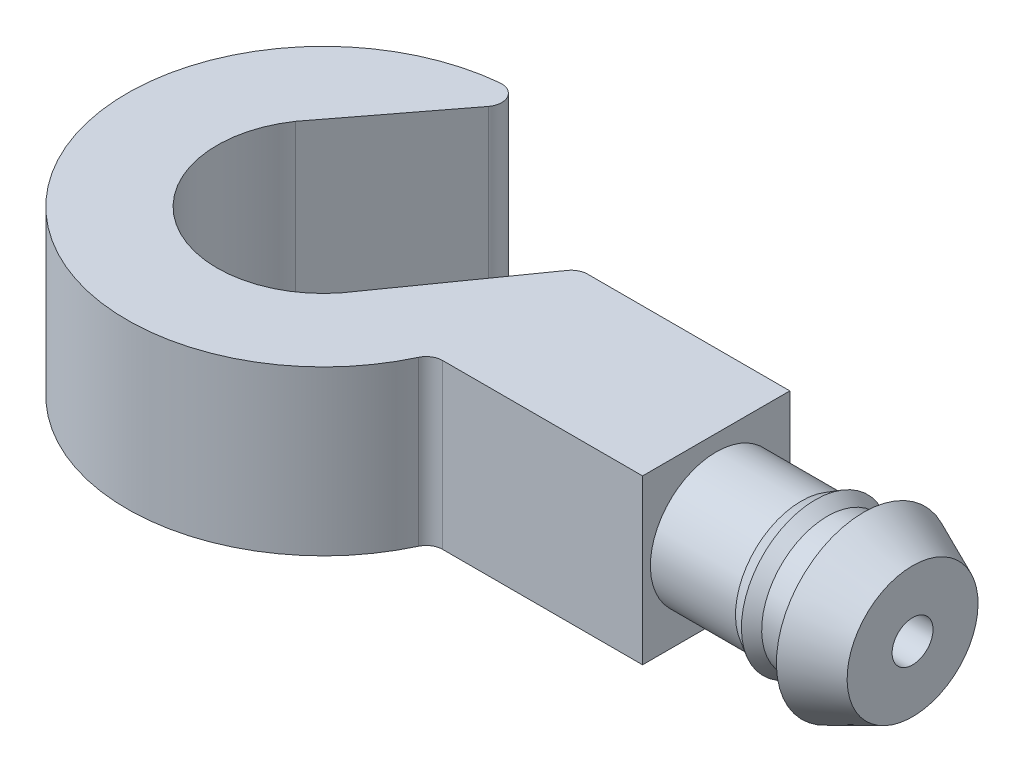
ISO-10303-21;
HEADER;
FILE_DESCRIPTION(('STEP AP214'),'2;1');
FILE_NAME('part.step','',(''),(''),'','','');
FILE_SCHEMA(('AUTOMOTIVE_DESIGN { 1 0 10303 214 1 1 1 1 }'));
ENDSEC;
DATA;
#1=APPLICATION_CONTEXT('core data for automotive mechanical design processes');
#2=APPLICATION_PROTOCOL_DEFINITION('international standard','automotive_design',2000,#1);
#3=PRODUCT_CONTEXT('',#1,'mechanical');
#4=PRODUCT('Part','Part','',(#3));
#5=PRODUCT_RELATED_PRODUCT_CATEGORY('part','',(#4));
#6=PRODUCT_DEFINITION_FORMATION('','',#4);
#7=PRODUCT_DEFINITION_CONTEXT('part definition',#1,'design');
#8=PRODUCT_DEFINITION('design','',#6,#7);
#9=PRODUCT_DEFINITION_SHAPE('','',#8);
#10=(LENGTH_UNIT() NAMED_UNIT(*) SI_UNIT(.MILLI.,.METRE.));
#11=(NAMED_UNIT(*) PLANE_ANGLE_UNIT() SI_UNIT($,.RADIAN.));
#12=(NAMED_UNIT(*) SI_UNIT($,.STERADIAN.) SOLID_ANGLE_UNIT());
#13=UNCERTAINTY_MEASURE_WITH_UNIT(LENGTH_MEASURE(1.E-05),#10,'distance_accuracy_value','');
#14=(GEOMETRIC_REPRESENTATION_CONTEXT(3) GLOBAL_UNCERTAINTY_ASSIGNED_CONTEXT((#13)) GLOBAL_UNIT_ASSIGNED_CONTEXT((#10,
#11,#12)) REPRESENTATION_CONTEXT('',''));
#15=CARTESIAN_POINT('',(0.,0.,0.));
#16=DIRECTION('',(0.,0.,1.));
#17=DIRECTION('',(1.,0.,0.));
#18=AXIS2_PLACEMENT_3D('',#15,#16,#17);
#19=CARTESIAN_POINT('',(-15.24,12.7,5.71500000000001));
#20=DIRECTION('',(0.,0.,-1.));
#21=DIRECTION('',(-1.,0.,0.));
#22=AXIS2_PLACEMENT_3D('',#19,#20,#21);
#23=PLANE('',#22);
#24=DIRECTION('',(1.,0.,0.));
#25=VECTOR('',#24,1.);
#26=CARTESIAN_POINT('',(-15.24,12.7,5.71500000000001));
#27=LINE('',#26,#25);
#28=CARTESIAN_POINT('',(-15.520391883475,12.7,5.71500000000001));
#29=VERTEX_POINT('',#28);
#30=CARTESIAN_POINT('',(0.,12.7,5.715));
#31=VERTEX_POINT('',#30);
#32=EDGE_CURVE('E263',#29,#31,#27,.T.);
#33=ORIENTED_EDGE('',*,*,#32,.F.);
#34=DIRECTION('',(0.,1.,0.));
#35=VECTOR('',#34,1.);
#36=CARTESIAN_POINT('',(-15.520391883475,0.,5.71500000000001));
#37=LINE('',#36,#35);
#38=CARTESIAN_POINT('',(-15.520391883475,0.,5.71500000000001));
#39=VERTEX_POINT('',#38);
#40=EDGE_CURVE('E279',#29,#39,#37,.F.);
#41=ORIENTED_EDGE('',*,*,#40,.T.);
#42=DIRECTION('',(1.,0.,0.));
#43=VECTOR('',#42,1.);
#44=CARTESIAN_POINT('',(-15.24,0.,5.71500000000001));
#45=LINE('',#44,#43);
#46=CARTESIAN_POINT('',(0.,0.,5.715));
#47=VERTEX_POINT('',#46);
#48=EDGE_CURVE('E283',#39,#47,#45,.T.);
#49=ORIENTED_EDGE('',*,*,#48,.T.);
#50=DIRECTION('',(0.,-1.,0.));
#51=VECTOR('',#50,1.);
#52=CARTESIAN_POINT('',(0.,12.7,5.715));
#53=LINE('',#52,#51);
#54=EDGE_CURVE('E225',#31,#47,#53,.T.);
#55=ORIENTED_EDGE('',*,*,#54,.F.);
#56=EDGE_LOOP('',(#33,#41,#49,#55));
#57=FACE_BOUND('',#56,.T.);
#58=ADVANCED_FACE('F37',(#57),#23,.F.);
#59=CARTESIAN_POINT('',(0.,12.7,5.715));
#60=DIRECTION('',(-1.,0.,0.));
#61=DIRECTION('',(0.,0.,1.));
#62=AXIS2_PLACEMENT_3D('',#59,#60,#61);
#63=PLANE('',#62);
#64=CARTESIAN_POINT('',(0.,6.35,0.));
#65=DIRECTION('',(1.,0.,0.));
#66=DIRECTION('',(0.,1.,0.));
#67=AXIS2_PLACEMENT_3D('',#64,#65,#66);
#68=CIRCLE('',#67,5.10717043465967);
#69=CARTESIAN_POINT('',(0.,11.4571704346597,0.));
#70=VERTEX_POINT('',#69);
#71=EDGE_CURVE('E224',#70,#70,#68,.T.);
#72=ORIENTED_EDGE('',*,*,#71,.F.);
#73=EDGE_LOOP('',(#72));
#74=FACE_BOUND('',#73,.T.);
#75=DIRECTION('',(0.,0.,-1.));
#76=VECTOR('',#75,1.);
#77=CARTESIAN_POINT('',(0.,0.,5.715));
#78=LINE('',#77,#76);
#79=CARTESIAN_POINT('',(0.,0.,-5.715));
#80=VERTEX_POINT('',#79);
#81=EDGE_CURVE('E264',#47,#80,#78,.T.);
#82=ORIENTED_EDGE('',*,*,#81,.T.);
#83=DIRECTION('',(0.,-1.,0.));
#84=VECTOR('',#83,1.);
#85=CARTESIAN_POINT('',(0.,12.7,-5.715));
#86=LINE('',#85,#84);
#87=CARTESIAN_POINT('',(0.,12.7,-5.715));
#88=VERTEX_POINT('',#87);
#89=EDGE_CURVE('E261',#88,#80,#86,.T.);
#90=ORIENTED_EDGE('',*,*,#89,.F.);
#91=DIRECTION('',(0.,0.,-1.));
#92=VECTOR('',#91,1.);
#93=CARTESIAN_POINT('',(0.,12.7,5.715));
#94=LINE('',#93,#92);
#95=EDGE_CURVE('E291',#31,#88,#94,.T.);
#96=ORIENTED_EDGE('',*,*,#95,.F.);
#97=ORIENTED_EDGE('',*,*,#54,.T.);
#98=EDGE_LOOP('',(#82,#90,#96,#97));
#99=FACE_BOUND('',#98,.T.);
#100=ADVANCED_FACE('F200',(#74,#99),#63,.F.);
#101=CARTESIAN_POINT('',(0.,12.7,-5.715));
#102=DIRECTION('',(0.,0.,1.));
#103=DIRECTION('',(1.,0.,0.));
#104=AXIS2_PLACEMENT_3D('',#101,#102,#103);
#105=PLANE('',#104);
#106=CARTESIAN_POINT('',(-3.175,6.35,-5.715));
#107=DIRECTION('',(0.,0.,-1.));
#108=DIRECTION('',(-1.,0.,0.));
#109=AXIS2_PLACEMENT_3D('',#106,#107,#108);
#110=CIRCLE('',#109,2.01929999999999);
#111=CARTESIAN_POINT('',(-5.19429999999999,6.35,-5.715));
#112=VERTEX_POINT('',#111);
#113=EDGE_CURVE('E252',#112,#112,#110,.T.);
#114=ORIENTED_EDGE('',*,*,#113,.F.);
#115=EDGE_LOOP('',(#114));
#116=FACE_BOUND('',#115,.T.);
#117=DIRECTION('',(-1.,0.,0.));
#118=VECTOR('',#117,1.);
#119=CARTESIAN_POINT('',(0.,0.,-5.715));
#120=LINE('',#119,#118);
#121=CARTESIAN_POINT('',(-15.6942687245524,0.,-5.715));
#122=VERTEX_POINT('',#121);
#123=EDGE_CURVE('E256',#80,#122,#120,.T.);
#124=ORIENTED_EDGE('',*,*,#123,.T.);
#125=DIRECTION('',(0.,-1.,0.));
#126=VECTOR('',#125,1.);
#127=CARTESIAN_POINT('',(-15.6942687245524,12.7,-5.715));
#128=LINE('',#127,#126);
#129=CARTESIAN_POINT('',(-15.6942687245524,12.7,-5.715));
#130=VERTEX_POINT('',#129);
#131=EDGE_CURVE('E259',#122,#130,#128,.F.);
#132=ORIENTED_EDGE('',*,*,#131,.T.);
#133=DIRECTION('',(-1.,0.,0.));
#134=VECTOR('',#133,1.);
#135=CARTESIAN_POINT('',(0.,12.7,-5.715));
#136=LINE('',#135,#134);
#137=EDGE_CURVE('E293',#88,#130,#136,.T.);
#138=ORIENTED_EDGE('',*,*,#137,.F.);
#139=ORIENTED_EDGE('',*,*,#89,.T.);
#140=EDGE_LOOP('',(#124,#132,#138,#139));
#141=FACE_BOUND('',#140,.T.);
#142=ADVANCED_FACE('F206',(#116,#141),#105,.F.);
#143=CARTESIAN_POINT('',(0.,12.7,0.));
#144=DIRECTION('',(0.,1.,0.));
#145=DIRECTION('',(0.,0.,1.));
#146=AXIS2_PLACEMENT_3D('',#143,#144,#145);
#147=PLANE('',#146);
#148=ORIENTED_EDGE('',*,*,#137,.T.);
#149=CARTESIAN_POINT('',(-15.6942687245524,12.7,-4.445));
#150=DIRECTION('',(0.,1.,0.));
#151=DIRECTION('',(0.,0.,1.));
#152=AXIS2_PLACEMENT_3D('',#149,#150,#151);
#153=CIRCLE('',#152,1.27);
#154=CARTESIAN_POINT('',(-16.7316496938484,12.7,-5.17762591036802));
#155=VERTEX_POINT('',#154);
#156=EDGE_CURVE('E130',#130,#155,#153,.T.);
#157=ORIENTED_EDGE('',*,*,#156,.T.);
#158=DIRECTION('',(-0.576870795565374,0.,0.816835408894455));
#159=VECTOR('',#158,1.);
#160=CARTESIAN_POINT('',(-16.3521418820828,12.7,-5.715));
#161=LINE('',#160,#159);
#162=CARTESIAN_POINT('',(-23.9998184323496,12.7,5.11392919879467));
#163=VERTEX_POINT('',#162);
#164=EDGE_CURVE('E122',#155,#163,#161,.T.);
#165=ORIENTED_EDGE('',*,*,#164,.T.);
#166=CARTESIAN_POINT('',(-30.48,12.7,0.));
#167=DIRECTION('',(0.,-1.,0.));
#168=DIRECTION('',(0.,0.,1.));
#169=AXIS2_PLACEMENT_3D('',#166,#167,#168);
#170=CIRCLE('',#169,8.255);
#171=CARTESIAN_POINT('',(-37.2965464783346,12.7,-4.6561485273458));
#172=VERTEX_POINT('',#171);
#173=EDGE_CURVE('E127',#163,#172,#170,.T.);
#174=ORIENTED_EDGE('',*,*,#173,.T.);
#175=DIRECTION('',(0.607155875225389,0.,-0.794582747849015));
#176=VECTOR('',#175,1.);
#177=CARTESIAN_POINT('',(-29.2473753554193,12.7,-15.1900703252346));
#178=LINE('',#177,#176);
#179=CARTESIAN_POINT('',(-30.8186520249042,12.7,-13.1337461017279));
#180=VERTEX_POINT('',#179);
#181=EDGE_CURVE('E149',#172,#180,#178,.T.);
#182=ORIENTED_EDGE('',*,*,#181,.T.);
#183=CARTESIAN_POINT('',(-31.8277721146724,12.7,-13.9048340632642));
#184=DIRECTION('',(0.,1.,0.));
#185=DIRECTION('',(0.,0.,1.));
#186=AXIS2_PLACEMENT_3D('',#183,#184,#185);
#187=CIRCLE('',#186,1.27);
#188=CARTESIAN_POINT('',(-31.9502968523699,12.7,-15.1689098871973));
#189=VERTEX_POINT('',#188);
#190=EDGE_CURVE('E59',#180,#189,#187,.T.);
#191=ORIENTED_EDGE('',*,*,#190,.T.);
#192=CARTESIAN_POINT('',(-30.48,12.7,0.));
#193=DIRECTION('',(0.,1.,0.));
#194=DIRECTION('',(0.,0.,1.));
#195=AXIS2_PLACEMENT_3D('',#192,#193,#194);
#196=CIRCLE('',#195,15.24);
#197=CARTESIAN_POINT('',(-16.6711309693616,12.7,6.44769230769231));
#198=VERTEX_POINT('',#197);
#199=EDGE_CURVE('E134',#189,#198,#196,.T.);
#200=ORIENTED_EDGE('',*,*,#199,.T.);
#201=CARTESIAN_POINT('',(-15.520391883475,12.7,6.985));
#202=DIRECTION('',(0.,1.,0.));
#203=DIRECTION('',(0.,0.,1.));
#204=AXIS2_PLACEMENT_3D('',#201,#202,#203);
#205=CIRCLE('',#204,1.27);
#206=EDGE_CURVE('E11',#198,#29,#205,.F.);
#207=ORIENTED_EDGE('',*,*,#206,.T.);
#208=ORIENTED_EDGE('',*,*,#32,.T.);
#209=ORIENTED_EDGE('',*,*,#95,.T.);
#210=EDGE_LOOP('',(#148,#157,#165,#174,#182,#191,#200,#207,#208,#209));
#211=FACE_BOUND('',#210,.T.);
#212=ADVANCED_FACE('F125',(#211),#147,.T.);
#213=CARTESIAN_POINT('',(0.,0.,0.));
#214=DIRECTION('',(0.,1.,0.));
#215=DIRECTION('',(0.,0.,1.));
#216=AXIS2_PLACEMENT_3D('',#213,#214,#215);
#217=PLANE('',#216);
#218=DIRECTION('',(-0.576870795565374,0.,0.816835408894455));
#219=VECTOR('',#218,1.);
#220=CARTESIAN_POINT('',(-16.3521418820828,0.,-5.715));
#221=LINE('',#220,#219);
#222=CARTESIAN_POINT('',(-16.7316496938484,0.,-5.17762591036802));
#223=VERTEX_POINT('',#222);
#224=CARTESIAN_POINT('',(-23.9998184323496,0.,5.11392919879467));
#225=VERTEX_POINT('',#224);
#226=EDGE_CURVE('E140',#223,#225,#221,.T.);
#227=ORIENTED_EDGE('',*,*,#226,.F.);
#228=CARTESIAN_POINT('',(-15.6942687245524,0.,-4.445));
#229=DIRECTION('',(0.,1.,0.));
#230=DIRECTION('',(0.,0.,1.));
#231=AXIS2_PLACEMENT_3D('',#228,#229,#230);
#232=CIRCLE('',#231,1.27);
#233=EDGE_CURVE('E266',#223,#122,#232,.F.);
#234=ORIENTED_EDGE('',*,*,#233,.T.);
#235=ORIENTED_EDGE('',*,*,#123,.F.);
#236=ORIENTED_EDGE('',*,*,#81,.F.);
#237=ORIENTED_EDGE('',*,*,#48,.F.);
#238=CARTESIAN_POINT('',(-15.520391883475,0.,6.985));
#239=DIRECTION('',(0.,1.,0.));
#240=DIRECTION('',(0.,0.,1.));
#241=AXIS2_PLACEMENT_3D('',#238,#239,#240);
#242=CIRCLE('',#241,1.27);
#243=CARTESIAN_POINT('',(-16.6711309693616,0.,6.44769230769231));
#244=VERTEX_POINT('',#243);
#245=EDGE_CURVE('E45',#39,#244,#242,.T.);
#246=ORIENTED_EDGE('',*,*,#245,.T.);
#247=CARTESIAN_POINT('',(-30.48,0.,0.));
#248=DIRECTION('',(0.,1.,0.));
#249=DIRECTION('',(0.,0.,1.));
#250=AXIS2_PLACEMENT_3D('',#247,#248,#249);
#251=CIRCLE('',#250,15.24);
#252=CARTESIAN_POINT('',(-31.9502968523699,0.,-15.1689098871973));
#253=VERTEX_POINT('',#252);
#254=EDGE_CURVE('E154',#253,#244,#251,.T.);
#255=ORIENTED_EDGE('',*,*,#254,.F.);
#256=CARTESIAN_POINT('',(-31.8277721146724,0.,-13.9048340632642));
#257=DIRECTION('',(0.,1.,0.));
#258=DIRECTION('',(0.,0.,1.));
#259=AXIS2_PLACEMENT_3D('',#256,#257,#258);
#260=CIRCLE('',#259,1.27);
#261=CARTESIAN_POINT('',(-30.8186520249042,0.,-13.1337461017279));
#262=VERTEX_POINT('',#261);
#263=EDGE_CURVE('E269',#253,#262,#260,.F.);
#264=ORIENTED_EDGE('',*,*,#263,.T.);
#265=DIRECTION('',(0.607155875225389,0.,-0.794582747849015));
#266=VECTOR('',#265,1.);
#267=CARTESIAN_POINT('',(-29.2473753554193,0.,-15.1900703252346));
#268=LINE('',#267,#266);
#269=CARTESIAN_POINT('',(-37.2965464783346,0.,-4.6561485273458));
#270=VERTEX_POINT('',#269);
#271=EDGE_CURVE('E159',#270,#262,#268,.T.);
#272=ORIENTED_EDGE('',*,*,#271,.F.);
#273=CARTESIAN_POINT('',(-30.48,0.,0.));
#274=DIRECTION('',(0.,-1.,0.));
#275=DIRECTION('',(0.,0.,1.));
#276=AXIS2_PLACEMENT_3D('',#273,#274,#275);
#277=CIRCLE('',#276,8.255);
#278=EDGE_CURVE('E157',#225,#270,#277,.T.);
#279=ORIENTED_EDGE('',*,*,#278,.F.);
#280=EDGE_LOOP('',(#227,#234,#235,#236,#237,#246,#255,#264,#272,#279));
#281=FACE_BOUND('',#280,.T.);
#282=ADVANCED_FACE('F239',(#281),#217,.F.);
#283=CARTESIAN_POINT('',(-3.175,6.35,1.397));
#284=DIRECTION('',(0.,0.,-1.));
#285=DIRECTION('',(-1.,0.,0.));
#286=AXIS2_PLACEMENT_3D('',#283,#284,#285);
#287=CONICAL_SURFACE('',#286,2.0193,1.02974425867665);
#288=CARTESIAN_POINT('',(-3.175,6.35,2.61031784800235));
#289=VERTEX_POINT('',#288);
#290=VERTEX_LOOP('',#289);
#291=FACE_BOUND('',#290,.T.);
#292=CARTESIAN_POINT('',(-3.175,6.35,1.397));
#293=DIRECTION('',(0.,0.,-1.));
#294=DIRECTION('',(-1.,0.,0.));
#295=AXIS2_PLACEMENT_3D('',#292,#293,#294);
#296=CIRCLE('',#295,2.0193);
#297=CARTESIAN_POINT('',(-1.30176076274278,7.10402072252689,1.397));
#298=VERTEX_POINT('',#297);
#299=CARTESIAN_POINT('',(-1.30176076274278,5.59597927747311,1.397));
#300=VERTEX_POINT('',#299);
#301=EDGE_CURVE('E296',#298,#300,#296,.T.);
#302=ORIENTED_EDGE('',*,*,#301,.T.);
#303=EDGE_CURVE('E317',#300,#298,#296,.T.);
#304=ORIENTED_EDGE('',*,*,#303,.T.);
#305=EDGE_LOOP('',(#302,#304));
#306=FACE_BOUND('',#305,.T.);
#307=ADVANCED_FACE('F234',(#291,#306),#287,.F.);
#308=CARTESIAN_POINT('',(-3.175,6.35,-5.715));
#309=DIRECTION('',(0.,0.,-1.));
#310=DIRECTION('',(-1.,0.,0.));
#311=AXIS2_PLACEMENT_3D('',#308,#309,#310);
#312=CYLINDRICAL_SURFACE('',#311,2.01929999999999);
#313=ORIENTED_EDGE('',*,*,#303,.F.);
#314=CARTESIAN_POINT('',(-1.30176076274278,5.59597927747311,1.397));
#315=CARTESIAN_POINT('',(-1.3189252722824,5.55333445369015,1.37397731107545));
#316=CARTESIAN_POINT('',(-1.33720235559559,5.51213569183799,1.34922496635558));
#317=CARTESIAN_POINT('',(-1.37551125525229,5.4327467373019,1.29656174257425));
#318=CARTESIAN_POINT('',(-1.39554113116701,5.39455330437895,1.26865434656214));
#319=CARTESIAN_POINT('',(-1.4576530894866,5.28445529442695,1.18051627856761));
#320=CARTESIAN_POINT('',(-1.50172558616293,5.21710861500393,1.11591136820101));
#321=CARTESIAN_POINT('',(-1.59102941158517,5.09528903580376,0.976928793266392));
#322=CARTESIAN_POINT('',(-1.63625567050075,5.04076794119972,0.902589403142751));
#323=CARTESIAN_POINT('',(-1.72350397804281,4.94468740245031,0.744186945734295));
#324=CARTESIAN_POINT('',(-1.76552992503983,4.90311199171789,0.660136033097868));
#325=CARTESIAN_POINT('',(-1.82599990137922,4.84706546836613,0.514769224100946));
#326=CARTESIAN_POINT('',(-1.84744523635542,4.82824348082837,0.456391697662005));
#327=CARTESIAN_POINT('',(-1.88385709060045,4.79723013928411,0.336017667110518));
#328=CARTESIAN_POINT('',(-1.89883971232497,4.78502228586012,0.274030599518605));
#329=CARTESIAN_POINT('',(-1.92001916038785,4.76797677075774,0.146695314326344));
#330=CARTESIAN_POINT('',(-1.92610725590739,4.76323026770973,0.0813154557744339));
#331=CARTESIAN_POINT('',(-1.92776240970703,4.76192748219747,-0.049665993200621));
#332=CARTESIAN_POINT('',(-1.92333124216813,4.76536981860215,-0.115267544369533));
#333=CARTESIAN_POINT('',(-1.9062926279262,4.77900001866926,-0.235019687908715));
#334=CARTESIAN_POINT('',(-1.89492624694295,4.78816823231637,-0.289480555536117));
#335=CARTESIAN_POINT('',(-1.86677046781845,4.81167434154733,-0.395828819494836));
#336=CARTESIAN_POINT('',(-1.84997452260843,4.82601848079719,-0.44771302125737));
#337=CARTESIAN_POINT('',(-1.80001106585602,4.87057023669086,-0.582549172362923));
#338=CARTESIAN_POINT('',(-1.76344227304507,4.9049518875894,-0.662851458399956));
#339=CARTESIAN_POINT('',(-1.68580055640023,4.98508407147306,-0.815230811767694));
#340=CARTESIAN_POINT('',(-1.64471593406197,5.03086454080111,-0.887285479484327));
#341=CARTESIAN_POINT('',(-1.56049543040523,5.13524479462134,-1.02583608282806));
#342=CARTESIAN_POINT('',(-1.51734374473122,5.19428782905781,-1.09198975274803));
#343=CARTESIAN_POINT('',(-1.43426373935156,5.32369056220844,-1.2143941608563));
#344=CARTESIAN_POINT('',(-1.39433021942744,5.39403143087609,-1.27066105609129));
#345=CARTESIAN_POINT('',(-1.32675783678505,5.53355026968125,-1.36360738708182));
#346=CARTESIAN_POINT('',(-1.2981736798233,5.60113501409576,-1.40197873265373));
#347=CARTESIAN_POINT('',(-1.24753978066248,5.74324929678438,-1.46907179176753));
#348=CARTESIAN_POINT('',(-1.22548695548104,5.81777553655895,-1.49779805893131));
#349=CARTESIAN_POINT('',(-1.18962973369955,5.9728381079786,-1.54418184441025));
#350=CARTESIAN_POINT('',(-1.17589256304423,6.05341765382067,-1.5617492059461));
#351=CARTESIAN_POINT('',(-1.15837910014041,6.21737852401965,-1.58410665694572));
#352=CARTESIAN_POINT('',(-1.15459428445868,6.30075738894363,-1.58890767984479));
#353=CARTESIAN_POINT('',(-1.15719258432818,6.45614176025595,-1.58560035162027));
#354=CARTESIAN_POINT('',(-1.1623125549497,6.52821074993117,-1.57909578255762));
#355=CARTESIAN_POINT('',(-1.17992414315917,6.669908990922,-1.5565862363788));
#356=CARTESIAN_POINT('',(-1.19241663815072,6.7395379508048,-1.54058012848385));
#357=CARTESIAN_POINT('',(-1.2238064517494,6.87462241522442,-1.49996847646934));
#358=CARTESIAN_POINT('',(-1.24269991886726,6.94008040137859,-1.47536810327502));
#359=CARTESIAN_POINT('',(-1.28565281719483,7.06579177931618,-1.41864690187257));
#360=CARTESIAN_POINT('',(-1.30971325133641,7.12604415747881,-1.3865246135168));
#361=CARTESIAN_POINT('',(-1.36568785046644,7.24957698032082,-1.31033039925728));
#362=CARTESIAN_POINT('',(-1.39824073772972,7.31189945257455,-1.26518066067684));
#363=CARTESIAN_POINT('',(-1.46649459384974,7.42849761073807,-1.16739099318283));
#364=CARTESIAN_POINT('',(-1.50220006798751,7.48276147351075,-1.11474027671817));
#365=CARTESIAN_POINT('',(-1.58252033175684,7.59387783184643,-0.99060539853502));
#366=CARTESIAN_POINT('',(-1.62739134553776,7.64875034058934,-0.917511077276833));
#367=CARTESIAN_POINT('',(-1.71434005898679,7.74580158132589,-0.761778934161578));
#368=CARTESIAN_POINT('',(-1.75642000600199,7.78799062508257,-0.679148940941821));
#369=CARTESIAN_POINT('',(-1.81818523488817,7.84591165753619,-0.534914815630107));
#370=CARTESIAN_POINT('',(-1.84054629038479,7.86573213566132,-0.47611309602237));
#371=CARTESIAN_POINT('',(-1.87888007267351,7.8986393002935,-0.354701415156681));
#372=CARTESIAN_POINT('',(-1.89486713311025,7.91174111474858,-0.29210036749157));
#373=CARTESIAN_POINT('',(-1.91801033835094,7.930439604404,-0.163229839948104));
#374=CARTESIAN_POINT('',(-1.92504984161912,7.93593723015768,-0.0969234408943634));
#375=CARTESIAN_POINT('',(-1.92827972039438,7.93848030371211,0.0361095545938113));
#376=CARTESIAN_POINT('',(-1.92447591712239,7.93553028661969,0.102835906385312));
#377=CARTESIAN_POINT('',(-1.90830675328586,7.92262036537141,0.223972381447884));
#378=CARTESIAN_POINT('',(-1.89733469251528,7.91379742452943,0.278709585556024));
#379=CARTESIAN_POINT('',(-1.8698318143995,7.89091852461821,0.385642642045155));
#380=CARTESIAN_POINT('',(-1.85329399833627,7.87685597455027,0.437835199558673));
#381=CARTESIAN_POINT('',(-1.80422824347788,7.83330989029694,0.57248990476285));
#382=CARTESIAN_POINT('',(-1.7683210046358,7.79975831794589,0.652392808460761));
#383=CARTESIAN_POINT('',(-1.69183923922731,7.72143225696399,0.804147223984056));
#384=CARTESIAN_POINT('',(-1.65125083494015,7.67662390870929,0.875973480834609));
#385=CARTESIAN_POINT('',(-1.5677720115432,7.5743132487902,1.01435904055072));
#386=CARTESIAN_POINT('',(-1.5248570749458,7.51635233745976,1.08056470883286));
#387=CARTESIAN_POINT('',(-1.44206443450608,7.38933803888984,1.20319430173243));
#388=CARTESIAN_POINT('',(-1.40217637072143,7.32032526015568,1.25965252149317));
#389=CARTESIAN_POINT('',(-1.35414989643229,7.22333949984414,1.32596767677224));
#390=CARTESIAN_POINT('',(-1.34320249021209,7.20015577632044,1.34095511598697));
#391=CARTESIAN_POINT('',(-1.32196661417579,7.15281465029167,1.36982222066634));
#392=CARTESIAN_POINT('',(-1.31167820315413,7.1286571612213,1.38370178731559));
#393=CARTESIAN_POINT('',(-1.30176076274285,7.10402072252747,1.39700000000089));
#394=B_SPLINE_CURVE_WITH_KNOTS('',3,(#314,#315,#316,#317,#318,#319,#320,#321,#322,#323,#324,
#325,#326,#327,#328,#329,#330,#331,#332,#333,#334,#335,#336,#337,#338,#339,#340,#341,#342,#343,
#344,#345,#346,#347,#348,#349,#350,#351,#352,#353,#354,#355,#356,#357,#358,#359,#360,#361,#362,
#363,#364,#365,#366,#367,#368,#369,#370,#371,#372,#373,#374,#375,#376,#377,#378,#379,#380,#381,
#382,#383,#384,#385,#386,#387,#388,#389,#390,#391,#392,#393),.UNSPECIFIED.,.F.,.F.,(4,2,2,2,2,2,
2,2,2,2,2,2,2,2,2,2,2,2,2,2,2,2,2,2,2,2,2,2,2,2,2,2,2,2,2,2,2,2,2,4),(0.,0.154087053017684,
0.308005631286179,0.616115055106168,0.923047507450804,1.22959989067077,1.42395203250329,
1.61781709062278,1.81403277041796,2.0102153587889,2.1787338229343,2.34745625250016,
2.62998251774915,2.91325874672823,3.2079815302291,3.50221810291732,3.74967329332945,
3.99701149070099,4.24632342249739,4.49542176798682,4.71199415738438,4.92859232624528,
5.14506039794959,5.36157052513376,5.61135829723671,5.8615089982462,6.16578089781331,
6.46980474860746,6.66709656591144,6.86394218259573,7.06332843482082,7.26260766684872,
7.43151321301254,7.60063194979064,7.88049643861938,8.16121303696238,8.45386139558348,
8.74545814191108,8.83451729894971,8.92358439065914),.UNSPECIFIED.);
#395=EDGE_CURVE('E214',#300,#298,#394,.T.);
#396=ORIENTED_EDGE('',*,*,#395,.T.);
#397=EDGE_LOOP('',(#313,#396));
#398=FACE_BOUND('',#397,.T.);
#399=ORIENTED_EDGE('',*,*,#113,.T.);
#400=EDGE_LOOP('',(#399));
#401=FACE_BOUND('',#400,.T.);
#402=ADVANCED_FACE('F228',(#398,#401),#312,.F.);
#403=CARTESIAN_POINT('',(15.2399757797537,6.35,0.));
#404=DIRECTION('',(1.,0.,0.));
#405=DIRECTION('',(0.,1.,0.));
#406=AXIS2_PLACEMENT_3D('',#403,#404,#405);
#407=CYLINDRICAL_SURFACE('',#406,5.10717043465967);
#408=CARTESIAN_POINT('',(8.63598788987687,6.35,0.));
#409=DIRECTION('',(1.,0.,0.));
#410=DIRECTION('',(0.,1.,0.));
#411=AXIS2_PLACEMENT_3D('',#408,#409,#410);
#412=CIRCLE('',#411,5.10717043465967);
#413=CARTESIAN_POINT('',(8.63598788987687,11.4571704346597,0.));
#414=VERTEX_POINT('',#413);
#415=EDGE_CURVE('E172',#414,#414,#412,.T.);
#416=ORIENTED_EDGE('',*,*,#415,.T.);
#417=EDGE_LOOP('',(#416));
#418=FACE_BOUND('',#417,.T.);
#419=CARTESIAN_POINT('',(11.4299757797537,6.35,0.));
#420=DIRECTION('',(1.,0.,0.));
#421=DIRECTION('',(0.,1.,0.));
#422=AXIS2_PLACEMENT_3D('',#419,#420,#421);
#423=CIRCLE('',#422,5.10717043465967);
#424=CARTESIAN_POINT('',(11.4299757797537,11.4571704346597,0.));
#425=VERTEX_POINT('',#424);
#426=EDGE_CURVE('E315',#425,#425,#423,.T.);
#427=ORIENTED_EDGE('',*,*,#426,.F.);
#428=EDGE_LOOP('',(#427));
#429=FACE_BOUND('',#428,.T.);
#430=ADVANCED_FACE('F233',(#418,#429),#407,.T.);
#431=CARTESIAN_POINT('',(11.4299757797537,13.1081704346597,0.));
#432=DIRECTION('',(-1.,0.,0.));
#433=DIRECTION('',(0.,-1.,0.));
#434=AXIS2_PLACEMENT_3D('',#431,#432,#433);
#435=PLANE('',#434);
#436=ORIENTED_EDGE('',*,*,#426,.T.);
#437=EDGE_LOOP('',(#436));
#438=FACE_BOUND('',#437,.T.);
#439=CARTESIAN_POINT('',(11.4299757797537,6.35,0.));
#440=DIRECTION('',(1.,0.,0.));
#441=DIRECTION('',(0.,1.,0.));
#442=AXIS2_PLACEMENT_3D('',#439,#440,#441);
#443=CIRCLE('',#442,6.75817043465967);
#444=CARTESIAN_POINT('',(11.4299757797537,13.1081704346597,0.));
#445=VERTEX_POINT('',#444);
#446=EDGE_CURVE('E312',#445,#445,#443,.T.);
#447=ORIENTED_EDGE('',*,*,#446,.F.);
#448=EDGE_LOOP('',(#447));
#449=FACE_BOUND('',#448,.T.);
#450=ADVANCED_FACE('F340',(#438,#449),#435,.T.);
#451=CARTESIAN_POINT('',(15.2399757797537,6.35,0.));
#452=DIRECTION('',(-1.,0.,0.));
#453=DIRECTION('',(0.,-1.,0.));
#454=AXIS2_PLACEMENT_3D('',#451,#452,#453);
#455=CONICAL_SURFACE('',#454,5.08,0.414896118389174);
#456=ORIENTED_EDGE('',*,*,#446,.T.);
#457=EDGE_LOOP('',(#456));
#458=FACE_BOUND('',#457,.T.);
#459=CARTESIAN_POINT('',(15.2399757797537,6.35,0.));
#460=DIRECTION('',(1.,0.,0.));
#461=DIRECTION('',(0.,1.,0.));
#462=AXIS2_PLACEMENT_3D('',#459,#460,#461);
#463=CIRCLE('',#462,5.08);
#464=CARTESIAN_POINT('',(15.2399757797537,11.43,0.));
#465=VERTEX_POINT('',#464);
#466=EDGE_CURVE('E309',#465,#465,#463,.T.);
#467=ORIENTED_EDGE('',*,*,#466,.F.);
#468=EDGE_LOOP('',(#467));
#469=FACE_BOUND('',#468,.T.);
#470=ADVANCED_FACE('F335',(#458,#469),#455,.T.);
#471=CARTESIAN_POINT('',(15.2399757797537,11.43,0.));
#472=DIRECTION('',(1.,0.,0.));
#473=DIRECTION('',(0.,1.,0.));
#474=AXIS2_PLACEMENT_3D('',#471,#472,#473);
#475=PLANE('',#474);
#476=CARTESIAN_POINT('',(15.2399757797537,6.35,0.));
#477=DIRECTION('',(1.,0.,0.));
#478=DIRECTION('',(0.,0.,-1.));
#479=AXIS2_PLACEMENT_3D('',#476,#477,#478);
#480=CIRCLE('',#479,1.58749999999999);
#481=CARTESIAN_POINT('',(15.2399757797537,6.35,-1.58749999999999));
#482=VERTEX_POINT('',#481);
#483=EDGE_CURVE('E143',#482,#482,#480,.T.);
#484=ORIENTED_EDGE('',*,*,#483,.F.);
#485=EDGE_LOOP('',(#484));
#486=FACE_BOUND('',#485,.T.);
#487=ORIENTED_EDGE('',*,*,#466,.T.);
#488=EDGE_LOOP('',(#487));
#489=FACE_BOUND('',#488,.T.);
#490=ADVANCED_FACE('F331',(#486,#489),#475,.T.);
#491=CARTESIAN_POINT('',(15.2399757797537,6.35,0.));
#492=DIRECTION('',(1.,0.,0.));
#493=DIRECTION('',(0.,1.,0.));
#494=AXIS2_PLACEMENT_3D('',#491,#492,#493);
#495=CYLINDRICAL_SURFACE('',#494,5.10717043465967);
#496=ORIENTED_EDGE('',*,*,#71,.T.);
#497=EDGE_LOOP('',(#496));
#498=FACE_BOUND('',#497,.T.);
#499=CARTESIAN_POINT('',(6.60398788987687,6.35,0.));
#500=DIRECTION('',(1.,0.,0.));
#501=DIRECTION('',(0.,1.,0.));
#502=AXIS2_PLACEMENT_3D('',#499,#500,#501);
#503=CIRCLE('',#502,5.10717043465967);
#504=CARTESIAN_POINT('',(6.60398788987687,11.4571704346597,0.));
#505=VERTEX_POINT('',#504);
#506=EDGE_CURVE('E308',#505,#505,#503,.T.);
#507=ORIENTED_EDGE('',*,*,#506,.F.);
#508=EDGE_LOOP('',(#507));
#509=FACE_BOUND('',#508,.T.);
#510=ADVANCED_FACE('F334',(#498,#509),#495,.T.);
#511=CARTESIAN_POINT('',(7.6989566285234,6.35,0.));
#512=DIRECTION('',(1.,0.,0.));
#513=DIRECTION('',(0.,1.,0.));
#514=AXIS2_PLACEMENT_3D('',#511,#512,#513);
#515=CONICAL_SURFACE('',#514,5.74217043465967,0.525527844556911);
#516=ORIENTED_EDGE('',*,*,#506,.T.);
#517=EDGE_LOOP('',(#516));
#518=FACE_BOUND('',#517,.T.);
#519=CARTESIAN_POINT('',(7.6989566285234,6.35,0.));
#520=DIRECTION('',(1.,0.,0.));
#521=DIRECTION('',(0.,1.,0.));
#522=AXIS2_PLACEMENT_3D('',#519,#520,#521);
#523=CIRCLE('',#522,5.74217043465967);
#524=CARTESIAN_POINT('',(7.6989566285234,12.0921704346597,0.));
#525=VERTEX_POINT('',#524);
#526=EDGE_CURVE('E360',#525,#525,#523,.T.);
#527=ORIENTED_EDGE('',*,*,#526,.F.);
#528=EDGE_LOOP('',(#527));
#529=FACE_BOUND('',#528,.T.);
#530=ADVANCED_FACE('F350',(#518,#529),#515,.T.);
#531=CARTESIAN_POINT('',(8.63598788987687,6.35,0.));
#532=DIRECTION('',(-1.,0.,0.));
#533=DIRECTION('',(0.,-1.,0.));
#534=AXIS2_PLACEMENT_3D('',#531,#532,#533);
#535=CONICAL_SURFACE('',#534,5.10717043465967,0.595583141100732);
#536=ORIENTED_EDGE('',*,*,#526,.T.);
#537=EDGE_LOOP('',(#536));
#538=FACE_BOUND('',#537,.T.);
#539=ORIENTED_EDGE('',*,*,#415,.F.);
#540=EDGE_LOOP('',(#539));
#541=FACE_BOUND('',#540,.T.);
#542=ADVANCED_FACE('F328',(#538,#541),#535,.T.);
#543=CARTESIAN_POINT('',(15.2399757797537,6.35,0.));
#544=DIRECTION('',(1.,0.,0.));
#545=DIRECTION('',(0.,0.,-1.));
#546=AXIS2_PLACEMENT_3D('',#543,#544,#545);
#547=CYLINDRICAL_SURFACE('',#546,1.58749999999999);
#548=CARTESIAN_POINT('',(-1.15570000000001,6.35,-1.58749999999999));
#549=CARTESIAN_POINT('',(-1.15570597799815,6.27342555957981,-1.58749382591431));
#550=CARTESIAN_POINT('',(-1.16010035348054,6.19674784656627,-1.58191432572348));
#551=CARTESIAN_POINT('',(-1.17728515914502,6.04585183925892,-1.55996569331444));
#552=CARTESIAN_POINT('',(-1.19009294761329,5.97163896361745,-1.54357425395795));
#553=CARTESIAN_POINT('',(-1.22288960889108,5.82825893065062,-1.50116570140141));
#554=CARTESIAN_POINT('',(-1.24283363504216,5.75906343730639,-1.4752086719653));
#555=CARTESIAN_POINT('',(-1.28844689478195,5.62652735341961,-1.41493897675274));
#556=CARTESIAN_POINT('',(-1.31411635553813,5.56318699533173,-1.38062597943246));
#557=CARTESIAN_POINT('',(-1.37908104028652,5.42258282824261,-1.29194272499935));
#558=CARTESIAN_POINT('',(-1.42004391695996,5.34788976816486,-1.23471763381827));
#559=CARTESIAN_POINT('',(-1.5058653480743,5.21064047840155,-1.10936693415982));
#560=CARTESIAN_POINT('',(-1.55073483798672,5.14812001357662,-1.04121024599233));
#561=CARTESIAN_POINT('',(-1.64095771555815,5.03486097094054,-0.894052686442409));
#562=CARTESIAN_POINT('',(-1.68630862479655,4.98430738840215,-0.814908244209734));
#563=CARTESIAN_POINT('',(-1.77133710737582,4.89708001719519,-0.646614352574376));
#564=CARTESIAN_POINT('',(-1.81103397707714,4.86035828056706,-0.557500880819155));
#565=CARTESIAN_POINT('',(-1.86295958405276,4.81481493014061,-0.408268776418168));
#566=CARTESIAN_POINT('',(-1.87976204393545,4.80073395487298,-0.351371586562814));
#567=CARTESIAN_POINT('',(-1.90638949173807,4.77885405358939,-0.23484856318452));
#568=CARTESIAN_POINT('',(-1.91623108142417,4.77104017445782,-0.175229585513801));
#569=CARTESIAN_POINT('',(-1.92731747814666,4.76225944942952,-0.0541909881948422));
#570=CARTESIAN_POINT('',(-1.92849699008357,4.76134460737452,0.00723881017837221));
#571=CARTESIAN_POINT('',(-1.92184019223364,4.76659364242492,0.129323525292457));
#572=CARTESIAN_POINT('',(-1.91399462350214,4.77276478912417,0.189977581592798));
#573=CARTESIAN_POINT('',(-1.88867024551654,4.79332747322412,0.319301233537369));
#574=CARTESIAN_POINT('',(-1.86972120795674,4.80899031588935,0.387467685456348));
#575=CARTESIAN_POINT('',(-1.82480862758969,4.84818728654542,0.519095598786786));
#576=CARTESIAN_POINT('',(-1.79882524735806,4.87174372047572,0.582543097294775));
#577=CARTESIAN_POINT('',(-1.73038973895601,4.93797009657289,0.731905954052611));
#578=CARTESIAN_POINT('',(-1.68578057489728,4.98447325376184,0.815122543604246));
#579=CARTESIAN_POINT('',(-1.59478243399625,5.09086551084638,0.97143235347821));
#580=CARTESIAN_POINT('',(-1.54839118892725,5.15077217203499,1.04451208710845));
#581=CARTESIAN_POINT('',(-1.45747091418389,5.28493224424687,1.18115494130255));
#582=CARTESIAN_POINT('',(-1.41299633561281,5.35944426139884,1.24450302467833));
#583=CARTESIAN_POINT('',(-1.33129014527632,5.52145700007394,1.35770854928324));
#584=CARTESIAN_POINT('',(-1.29403848388086,5.60892054281484,1.40760348930057));
#585=CARTESIAN_POINT('',(-1.24020292336926,5.76778919425451,1.47864286613982));
#586=CARTESIAN_POINT('',(-1.22076170745234,5.83638115925872,1.50392763287987));
#587=CARTESIAN_POINT('',(-1.18895522486589,5.97792175311034,1.54503377878838));
#588=CARTESIAN_POINT('',(-1.17658456454644,6.05086701408032,1.56086237185193));
#589=CARTESIAN_POINT('',(-1.15992105874906,6.19951878586878,1.58214131171923));
#590=CARTESIAN_POINT('',(-1.15566395785334,6.27523602430891,1.58754573571654));
#591=CARTESIAN_POINT('',(-1.15573648789007,6.42666150395239,1.58745369729254));
#592=CARTESIAN_POINT('',(-1.16006570636392,6.5023697454132,1.58195775848891));
#593=CARTESIAN_POINT('',(-1.17632406583305,6.64623619772826,1.56119393007383));
#594=CARTESIAN_POINT('',(-1.18771752629297,6.71455811414855,1.54661449149706));
#595=CARTESIAN_POINT('',(-1.21675185501572,6.84746166469452,1.50912550118107));
#596=CARTESIAN_POINT('',(-1.23439422226954,6.91204239705428,1.48621395069529));
#597=CARTESIAN_POINT('',(-1.27634148737812,7.04109957477521,1.43102570652316));
#598=CARTESIAN_POINT('',(-1.3010516132477,7.10519313304442,1.39816844928925));
#599=CARTESIAN_POINT('',(-1.35487757892687,7.22702340694852,1.32515565423759));
#600=CARTESIAN_POINT('',(-1.38399540278183,7.28475723954566,1.28499682810546));
#601=CARTESIAN_POINT('',(-1.45105533225463,7.40410350042487,1.18992578236007));
#602=CARTESIAN_POINT('',(-1.48961295336019,7.46429164302189,1.13366299634857));
#603=CARTESIAN_POINT('',(-1.56824621349048,7.57496009872371,1.01308485062027));
#604=CARTESIAN_POINT('',(-1.60832390499092,7.62542668312015,0.948758311765227));
#605=CARTESIAN_POINT('',(-1.68594103776205,7.7151747133414,0.814152045088018));
#606=CARTESIAN_POINT('',(-1.7235186946208,7.75470120552484,0.744058146819828));
#607=CARTESIAN_POINT('',(-1.79332653745312,7.82340999158575,0.596501820938121));
#608=CARTESIAN_POINT('',(-1.82556786388336,7.85261398398195,0.519055289314208));
#609=CARTESIAN_POINT('',(-1.87071470553343,7.8917561633928,0.382694589494248));
#610=CARTESIAN_POINT('',(-1.88651040340471,7.90486648636754,0.32567051175525));
#611=CARTESIAN_POINT('',(-1.91091730119994,7.92477640246781,0.209082187738136));
#612=CARTESIAN_POINT('',(-1.91954465051184,7.93159018481694,0.149523970783334));
#613=CARTESIAN_POINT('',(-1.92815119698902,7.9383883601584,0.0289727539358156));
#614=CARTESIAN_POINT('',(-1.92807473279709,7.93832879770634,-0.0320269859760799));
#615=CARTESIAN_POINT('',(-1.91914707458047,7.9312754778056,-0.152996696725058));
#616=CARTESIAN_POINT('',(-1.91028505913513,7.92427316877142,-0.21296530481095));
#617=CARTESIAN_POINT('',(-1.88268650900174,7.90173128278776,-0.342811085682088));
#618=CARTESIAN_POINT('',(-1.86223654952167,7.88467982956929,-0.412046420514929));
#619=CARTESIAN_POINT('',(-1.81445083672623,7.8424788402778,-0.545521083398477));
#620=CARTESIAN_POINT('',(-1.78709553079885,7.81730625182285,-0.609745535430014));
#621=CARTESIAN_POINT('',(-1.71600469483068,7.74726303616267,-0.75983403495987));
#622=CARTESIAN_POINT('',(-1.67031362944143,7.69858514488405,-0.842988226032403));
#623=CARTESIAN_POINT('',(-1.57772845905099,7.58756008451543,-0.998879805525752));
#624=CARTESIAN_POINT('',(-1.53083301869093,7.52519710831586,-1.07160498584651));
#625=CARTESIAN_POINT('',(-1.43975241286026,7.38610316133474,-1.20672290418716));
#626=CARTESIAN_POINT('',(-1.39561718360001,7.30917457498193,-1.26894815744085));
#627=CARTESIAN_POINT('',(-1.31530017429926,7.14221566568214,-1.37930741212069));
#628=CARTESIAN_POINT('',(-1.27909703986962,7.05222163193809,-1.42747936614319));
#629=CARTESIAN_POINT('',(-1.22827280711041,6.8909324398162,-1.49420019056757));
#630=CARTESIAN_POINT('',(-1.21044100294604,6.82251432214634,-1.51730270425683));
#631=CARTESIAN_POINT('',(-1.18187250593456,6.68185360911044,-1.55411673673716));
#632=CARTESIAN_POINT('',(-1.17111794272604,6.609621147778,-1.56785191170971));
#633=CARTESIAN_POINT('',(-1.16146668726592,6.50564204583794,-1.58015940072481));
#634=CARTESIAN_POINT('',(-1.15930906187121,6.47462546958844,-1.58290716016174));
#635=CARTESIAN_POINT('',(-1.15642432989401,6.41241167646601,-1.58657893481871));
#636=CARTESIAN_POINT('',(-1.15569756315901,6.38121441844305,-1.58750251677312));
#637=CARTESIAN_POINT('',(-1.15570000000001,6.35,-1.58749999999999));
#638=B_SPLINE_CURVE_WITH_KNOTS('',3,(#548,#549,#550,#551,#552,#553,#554,#555,#556,#557,#558,
#559,#560,#561,#562,#563,#564,#565,#566,#567,#568,#569,#570,#571,#572,#573,#574,#575,#576,#577,
#578,#579,#580,#581,#582,#583,#584,#585,#586,#587,#588,#589,#590,#591,#592,#593,#594,#595,#596,
#597,#598,#599,#600,#601,#602,#603,#604,#605,#606,#607,#608,#609,#610,#611,#612,#613,#614,#615,
#616,#617,#618,#619,#620,#621,#622,#623,#624,#625,#626,#627,#628,#629,#630,#631,#632,#633,#634,
#635,#636,#637),.UNSPECIFIED.,.T.,.F.,(4,2,2,2,2,2,2,2,2,2,2,2,2,2,2,2,2,2,2,2,2,2,2,2,2,2,2,2,
2,2,2,2,2,2,2,2,2,2,2,2,2,2,2,2,4),(0.,0.229587742073462,0.45965065630007,0.688292458894244,
0.916943334899706,1.22319865509434,1.53034065101275,1.8419590836672,2.1524871291356,
2.33479274147416,2.51666207284681,2.69990094889669,2.88332797981272,3.09951478806254,
3.31631772865295,3.63043853599979,3.94497334041511,4.2656841328486,4.58549152333714,
4.81150811014691,5.03735205324409,5.26418868072266,5.49101441197773,5.70244736595583,
5.91393107296713,6.14152890873084,6.36922949986788,6.64115146100213,6.91345465742409,
7.17904566380684,7.44407501436306,7.62524352597656,7.80600277247672,7.98791804865404,
8.17005767394741,8.39135881510155,8.6132937443877,8.9315769264664,9.25022969852371,
9.57356366836236,9.89601617702787,10.1182891613873,10.3399987203691,10.4335644884799,
10.5271524769935),.UNSPECIFIED.);
#639=EDGE_CURVE('E165',#300,#298,#638,.T.);
#640=ORIENTED_EDGE('',*,*,#639,.T.);
#641=ORIENTED_EDGE('',*,*,#395,.F.);
#642=EDGE_LOOP('',(#640,#641));
#643=FACE_BOUND('',#642,.T.);
#644=ORIENTED_EDGE('',*,*,#483,.T.);
#645=EDGE_LOOP('',(#644));
#646=FACE_BOUND('',#645,.T.);
#647=ADVANCED_FACE('F174',(#643,#646),#547,.F.);
#648=CARTESIAN_POINT('',(-3.175,6.35,-5.715));
#649=DIRECTION('',(0.,0.,-1.));
#650=DIRECTION('',(-1.,0.,0.));
#651=AXIS2_PLACEMENT_3D('',#648,#649,#650);
#652=CYLINDRICAL_SURFACE('',#651,2.01929999999999);
#653=ORIENTED_EDGE('',*,*,#639,.F.);
#654=ORIENTED_EDGE('',*,*,#301,.F.);
#655=EDGE_LOOP('',(#653,#654));
#656=FACE_BOUND('',#655,.T.);
#657=ADVANCED_FACE('F177',(#656),#652,.T.);
#658=CARTESIAN_POINT('',(-30.48,12.7,0.));
#659=DIRECTION('',(0.,-1.,0.));
#660=DIRECTION('',(0.,0.,-1.));
#661=AXIS2_PLACEMENT_3D('',#658,#659,#660);
#662=CYLINDRICAL_SURFACE('',#661,15.24);
#663=ORIENTED_EDGE('',*,*,#199,.F.);
#664=DIRECTION('',(0.,-1.,0.));
#665=VECTOR('',#664,1.);
#666=CARTESIAN_POINT('',(-31.9502968523699,12.7,-15.1689098871973));
#667=LINE('',#666,#665);
#668=EDGE_CURVE('E274',#189,#253,#667,.T.);
#669=ORIENTED_EDGE('',*,*,#668,.T.);
#670=ORIENTED_EDGE('',*,*,#254,.T.);
#671=DIRECTION('',(0.,-1.,0.));
#672=VECTOR('',#671,1.);
#673=CARTESIAN_POINT('',(-16.6711309693616,12.7,6.44769230769232));
#674=LINE('',#673,#672);
#675=EDGE_CURVE('E52',#244,#198,#674,.F.);
#676=ORIENTED_EDGE('',*,*,#675,.T.);
#677=EDGE_LOOP('',(#663,#669,#670,#676));
#678=FACE_BOUND('',#677,.T.);
#679=ADVANCED_FACE('F181',(#678),#662,.T.);
#680=CARTESIAN_POINT('',(-16.3521418820828,12.7,-5.715));
#681=DIRECTION('',(0.816835408894455,0.,0.576870795565374));
#682=DIRECTION('',(0.576870795565374,0.,-0.816835408894455));
#683=AXIS2_PLACEMENT_3D('',#680,#681,#682);
#684=PLANE('',#683);
#685=ORIENTED_EDGE('',*,*,#164,.F.);
#686=DIRECTION('',(0.,-1.,0.));
#687=VECTOR('',#686,1.);
#688=CARTESIAN_POINT('',(-16.7316496938484,12.7,-5.17762591036802));
#689=LINE('',#688,#687);
#690=EDGE_CURVE('E223',#155,#223,#689,.T.);
#691=ORIENTED_EDGE('',*,*,#690,.T.);
#692=ORIENTED_EDGE('',*,*,#226,.T.);
#693=DIRECTION('',(0.,-1.,0.));
#694=VECTOR('',#693,1.);
#695=CARTESIAN_POINT('',(-23.9998184323496,12.7,5.11392919879467));
#696=LINE('',#695,#694);
#697=EDGE_CURVE('E137',#163,#225,#696,.T.);
#698=ORIENTED_EDGE('',*,*,#697,.F.);
#699=EDGE_LOOP('',(#685,#691,#692,#698));
#700=FACE_BOUND('',#699,.T.);
#701=ADVANCED_FACE('F138',(#700),#684,.F.);
#702=CARTESIAN_POINT('',(-30.48,12.7,0.));
#703=DIRECTION('',(0.,-1.,0.));
#704=DIRECTION('',(0.,0.,-1.));
#705=AXIS2_PLACEMENT_3D('',#702,#703,#704);
#706=CYLINDRICAL_SURFACE('',#705,8.255);
#707=ORIENTED_EDGE('',*,*,#278,.T.);
#708=DIRECTION('',(0.,-1.,0.));
#709=VECTOR('',#708,1.);
#710=CARTESIAN_POINT('',(-37.2965464783346,12.7,-4.6561485273458));
#711=LINE('',#710,#709);
#712=EDGE_CURVE('E144',#172,#270,#711,.T.);
#713=ORIENTED_EDGE('',*,*,#712,.F.);
#714=ORIENTED_EDGE('',*,*,#173,.F.);
#715=ORIENTED_EDGE('',*,*,#697,.T.);
#716=EDGE_LOOP('',(#707,#713,#714,#715));
#717=FACE_BOUND('',#716,.T.);
#718=ADVANCED_FACE('F146',(#717),#706,.F.);
#719=CARTESIAN_POINT('',(-29.2473753554193,12.7,-15.1900703252346));
#720=DIRECTION('',(-0.794582747849015,0.,-0.607155875225389));
#721=DIRECTION('',(-0.607155875225389,0.,0.794582747849015));
#722=AXIS2_PLACEMENT_3D('',#719,#720,#721);
#723=PLANE('',#722);
#724=ORIENTED_EDGE('',*,*,#271,.T.);
#725=DIRECTION('',(0.,-1.,0.));
#726=VECTOR('',#725,1.);
#727=CARTESIAN_POINT('',(-30.8186520249042,12.7,-13.1337461017279));
#728=LINE('',#727,#726);
#729=EDGE_CURVE('E277',#262,#180,#728,.F.);
#730=ORIENTED_EDGE('',*,*,#729,.T.);
#731=ORIENTED_EDGE('',*,*,#181,.F.);
#732=ORIENTED_EDGE('',*,*,#712,.T.);
#733=EDGE_LOOP('',(#724,#730,#731,#732));
#734=FACE_BOUND('',#733,.T.);
#735=ADVANCED_FACE('F189',(#734),#723,.F.);
#736=CARTESIAN_POINT('',(-15.6942687245524,12.7,-4.445));
#737=DIRECTION('',(0.,-1.,0.));
#738=DIRECTION('',(0.,0.,-1.));
#739=AXIS2_PLACEMENT_3D('',#736,#737,#738);
#740=CYLINDRICAL_SURFACE('',#739,1.27);
#741=ORIENTED_EDGE('',*,*,#156,.F.);
#742=ORIENTED_EDGE('',*,*,#131,.F.);
#743=ORIENTED_EDGE('',*,*,#233,.F.);
#744=ORIENTED_EDGE('',*,*,#690,.F.);
#745=EDGE_LOOP('',(#741,#742,#743,#744));
#746=FACE_BOUND('',#745,.T.);
#747=ADVANCED_FACE('F191',(#746),#740,.T.);
#748=CARTESIAN_POINT('',(-31.8277721146724,12.7,-13.9048340632642));
#749=DIRECTION('',(0.,-1.,0.));
#750=DIRECTION('',(0.,0.,-1.));
#751=AXIS2_PLACEMENT_3D('',#748,#749,#750);
#752=CYLINDRICAL_SURFACE('',#751,1.27);
#753=ORIENTED_EDGE('',*,*,#190,.F.);
#754=ORIENTED_EDGE('',*,*,#729,.F.);
#755=ORIENTED_EDGE('',*,*,#263,.F.);
#756=ORIENTED_EDGE('',*,*,#668,.F.);
#757=EDGE_LOOP('',(#753,#754,#755,#756));
#758=FACE_BOUND('',#757,.T.);
#759=ADVANCED_FACE('F196',(#758),#752,.T.);
#760=CARTESIAN_POINT('',(-15.520391883475,12.7,6.985));
#761=DIRECTION('',(0.,-1.,0.));
#762=DIRECTION('',(0.,0.,-1.));
#763=AXIS2_PLACEMENT_3D('',#760,#761,#762);
#764=CYLINDRICAL_SURFACE('',#763,1.27);
#765=ORIENTED_EDGE('',*,*,#206,.F.);
#766=ORIENTED_EDGE('',*,*,#675,.F.);
#767=ORIENTED_EDGE('',*,*,#245,.F.);
#768=ORIENTED_EDGE('',*,*,#40,.F.);
#769=EDGE_LOOP('',(#765,#766,#767,#768));
#770=FACE_BOUND('',#769,.T.);
#771=ADVANCED_FACE('F39',(#770),#764,.F.);
#772=CLOSED_SHELL('',(#58,#100,#142,#212,#282,#307,#402,#430,#450,#470,#490,#510,#530,#542,#647,
#657,#679,#701,#718,#735,#747,#759,#771));
#773=MANIFOLD_SOLID_BREP('B2',#772);
#774=ADVANCED_BREP_SHAPE_REPRESENTATION('',(#18,#773),#14);
#775=SHAPE_DEFINITION_REPRESENTATION(#9,#774);
ENDSEC;
END-ISO-10303-21;
